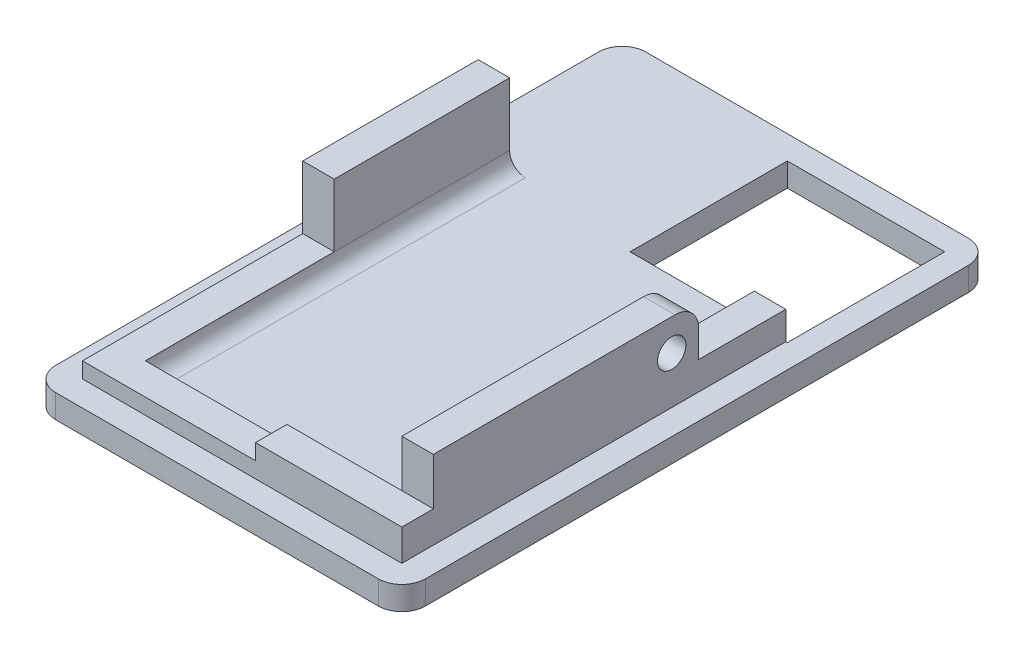
ISO-10303-21;
HEADER;
FILE_DESCRIPTION(('STEP AP214'),'2;1');
FILE_NAME('part.step','',(''),(''),'','','');
FILE_SCHEMA(('AUTOMOTIVE_DESIGN { 1 0 10303 214 1 1 1 1 }'));
ENDSEC;
DATA;
#1=APPLICATION_CONTEXT('core data for automotive mechanical design processes');
#2=APPLICATION_PROTOCOL_DEFINITION('international standard','automotive_design',2000,#1);
#3=PRODUCT_CONTEXT('',#1,'mechanical');
#4=PRODUCT('Part','Part','',(#3));
#5=PRODUCT_RELATED_PRODUCT_CATEGORY('part','',(#4));
#6=PRODUCT_DEFINITION_FORMATION('','',#4);
#7=PRODUCT_DEFINITION_CONTEXT('part definition',#1,'design');
#8=PRODUCT_DEFINITION('design','',#6,#7);
#9=PRODUCT_DEFINITION_SHAPE('','',#8);
#10=(LENGTH_UNIT() NAMED_UNIT(*) SI_UNIT(.MILLI.,.METRE.));
#11=(NAMED_UNIT(*) PLANE_ANGLE_UNIT() SI_UNIT($,.RADIAN.));
#12=(NAMED_UNIT(*) SI_UNIT($,.STERADIAN.) SOLID_ANGLE_UNIT());
#13=UNCERTAINTY_MEASURE_WITH_UNIT(LENGTH_MEASURE(1.E-05),#10,'distance_accuracy_value','');
#14=(GEOMETRIC_REPRESENTATION_CONTEXT(3) GLOBAL_UNCERTAINTY_ASSIGNED_CONTEXT((#13)) GLOBAL_UNIT_ASSIGNED_CONTEXT((#10,
#11,#12)) REPRESENTATION_CONTEXT('',''));
#15=CARTESIAN_POINT('',(0.,0.,0.));
#16=DIRECTION('',(0.,0.,1.));
#17=DIRECTION('',(1.,0.,0.));
#18=AXIS2_PLACEMENT_3D('',#15,#16,#17);
#19=CARTESIAN_POINT('',(0.,6.5,0.));
#20=DIRECTION('',(0.,1.,0.));
#21=DIRECTION('',(0.,0.,1.));
#22=AXIS2_PLACEMENT_3D('',#19,#20,#21);
#23=PLANE('',#22);
#24=DIRECTION('',(0.,0.,1.));
#25=VECTOR('',#24,1.);
#26=CARTESIAN_POINT('',(-10.15,6.5,-8.));
#27=LINE('',#26,#25);
#28=CARTESIAN_POINT('',(-10.15,6.5,-8.));
#29=VERTEX_POINT('',#28);
#30=CARTESIAN_POINT('',(-10.15,6.5,3.15));
#31=VERTEX_POINT('',#30);
#32=EDGE_CURVE('E382',#29,#31,#27,.T.);
#33=ORIENTED_EDGE('',*,*,#32,.T.);
#34=DIRECTION('',(-1.,0.,0.));
#35=VECTOR('',#34,1.);
#36=CARTESIAN_POINT('',(-10.15,6.5,3.15));
#37=LINE('',#36,#35);
#38=CARTESIAN_POINT('',(-8.15,6.5,3.15));
#39=VERTEX_POINT('',#38);
#40=EDGE_CURVE('E352',#39,#31,#37,.T.);
#41=ORIENTED_EDGE('',*,*,#40,.F.);
#42=DIRECTION('',(0.,0.,-1.));
#43=VECTOR('',#42,1.);
#44=CARTESIAN_POINT('',(-8.15,6.5,-8.));
#45=LINE('',#44,#43);
#46=CARTESIAN_POINT('',(-8.15,6.5,-8.));
#47=VERTEX_POINT('',#46);
#48=EDGE_CURVE('E393',#39,#47,#45,.T.);
#49=ORIENTED_EDGE('',*,*,#48,.T.);
#50=DIRECTION('',(-1.,0.,0.));
#51=VECTOR('',#50,1.);
#52=CARTESIAN_POINT('',(-10.15,6.5,-8.));
#53=LINE('',#52,#51);
#54=EDGE_CURVE('E396',#47,#29,#53,.T.);
#55=ORIENTED_EDGE('',*,*,#54,.T.);
#56=EDGE_LOOP('',(#33,#41,#49,#55));
#57=FACE_BOUND('',#56,.T.);
#58=ADVANCED_FACE('F38',(#57),#23,.T.);
#59=CARTESIAN_POINT('',(0.,1.5,0.));
#60=DIRECTION('',(0.,1.,0.));
#61=DIRECTION('',(0.,0.,1.));
#62=AXIS2_PLACEMENT_3D('',#59,#60,#61);
#63=PLANE('',#62);
#64=DIRECTION('',(1.,0.,0.));
#65=VECTOR('',#64,1.);
#66=CARTESIAN_POINT('',(0.,1.5,-7.24999999999999));
#67=LINE('',#66,#65);
#68=CARTESIAN_POINT('',(0.250000000000004,1.5,-7.24999999999999));
#69=VERTEX_POINT('',#68);
#70=CARTESIAN_POINT('',(7.15,1.5,-7.24999999999999));
#71=VERTEX_POINT('',#70);
#72=EDGE_CURVE('E297',#69,#71,#67,.T.);
#73=ORIENTED_EDGE('',*,*,#72,.F.);
#74=DIRECTION('',(0.,0.,1.));
#75=VECTOR('',#74,1.);
#76=CARTESIAN_POINT('',(0.250000000000003,1.5,0.));
#77=LINE('',#76,#75);
#78=CARTESIAN_POINT('',(0.250000000000005,1.5,-17.25));
#79=VERTEX_POINT('',#78);
#80=EDGE_CURVE('E309',#79,#69,#77,.T.);
#81=ORIENTED_EDGE('',*,*,#80,.F.);
#82=DIRECTION('',(-1.,0.,0.));
#83=VECTOR('',#82,1.);
#84=CARTESIAN_POINT('',(0.,1.5,-17.25));
#85=LINE('',#84,#83);
#86=CARTESIAN_POINT('',(10.25,1.5,-17.25));
#87=VERTEX_POINT('',#86);
#88=EDGE_CURVE('E303',#87,#79,#85,.T.);
#89=ORIENTED_EDGE('',*,*,#88,.F.);
#90=DIRECTION('',(0.,0.,-1.));
#91=VECTOR('',#90,1.);
#92=CARTESIAN_POINT('',(10.25,1.5,0.));
#93=LINE('',#92,#91);
#94=CARTESIAN_POINT('',(10.25,1.5,-7.24999999999999));
#95=VERTEX_POINT('',#94);
#96=EDGE_CURVE('E306',#95,#87,#93,.T.);
#97=ORIENTED_EDGE('',*,*,#96,.F.);
#98=CARTESIAN_POINT('',(10.15,1.5,-7.24999999999999));
#99=VERTEX_POINT('',#98);
#100=EDGE_CURVE('E300',#99,#95,#67,.T.);
#101=ORIENTED_EDGE('',*,*,#100,.F.);
#102=DIRECTION('',(0.,0.,-1.));
#103=VECTOR('',#102,1.);
#104=CARTESIAN_POINT('',(10.15,1.5,17.15));
#105=LINE('',#104,#103);
#106=CARTESIAN_POINT('',(10.15,1.5,17.15));
#107=VERTEX_POINT('',#106);
#108=EDGE_CURVE('E407',#107,#99,#105,.T.);
#109=ORIENTED_EDGE('',*,*,#108,.F.);
#110=DIRECTION('',(1.,0.,0.));
#111=VECTOR('',#110,1.);
#112=CARTESIAN_POINT('',(-8.79212820565967,1.5,17.15));
#113=LINE('',#112,#111);
#114=CARTESIAN_POINT('',(-10.15,1.5,17.15));
#115=VERTEX_POINT('',#114);
#116=EDGE_CURVE('E403',#115,#107,#113,.T.);
#117=ORIENTED_EDGE('',*,*,#116,.F.);
#118=DIRECTION('',(0.,0.,1.));
#119=VECTOR('',#118,1.);
#120=CARTESIAN_POINT('',(-10.15,1.5,-8.));
#121=LINE('',#120,#119);
#122=CARTESIAN_POINT('',(-10.15,1.5,-8.));
#123=VERTEX_POINT('',#122);
#124=EDGE_CURVE('E379',#123,#115,#121,.T.);
#125=ORIENTED_EDGE('',*,*,#124,.F.);
#126=DIRECTION('',(-1.,0.,0.));
#127=VECTOR('',#126,1.);
#128=CARTESIAN_POINT('',(-10.15,1.5,-8.));
#129=LINE('',#128,#127);
#130=CARTESIAN_POINT('',(-7.15,1.5,-8.));
#131=VERTEX_POINT('',#130);
#132=EDGE_CURVE('E387',#131,#123,#129,.T.);
#133=ORIENTED_EDGE('',*,*,#132,.F.);
#134=DIRECTION('',(0.,0.,-1.));
#135=VECTOR('',#134,1.);
#136=CARTESIAN_POINT('',(-7.15,1.5,0.));
#137=LINE('',#136,#135);
#138=CARTESIAN_POINT('',(-7.15,1.5,14.15));
#139=VERTEX_POINT('',#138);
#140=EDGE_CURVE('E524',#131,#139,#137,.F.);
#141=ORIENTED_EDGE('',*,*,#140,.T.);
#142=DIRECTION('',(-1.,0.,0.));
#143=VECTOR('',#142,1.);
#144=CARTESIAN_POINT('',(0.,1.5,14.15));
#145=LINE('',#144,#143);
#146=CARTESIAN_POINT('',(7.15000000000001,1.5,14.15));
#147=VERTEX_POINT('',#146);
#148=EDGE_CURVE('E521',#139,#147,#145,.F.);
#149=ORIENTED_EDGE('',*,*,#148,.T.);
#150=DIRECTION('',(0.,0.,1.));
#151=VECTOR('',#150,1.);
#152=CARTESIAN_POINT('',(7.15,1.5,0.));
#153=LINE('',#152,#151);
#154=EDGE_CURVE('E517',#147,#71,#153,.F.);
#155=ORIENTED_EDGE('',*,*,#154,.T.);
#156=EDGE_LOOP('',(#73,#81,#89,#97,#101,#109,#117,#125,#133,#141,#149,#155));
#157=FACE_BOUND('',#156,.T.);
#158=DIRECTION('',(-1.,0.,0.));
#159=VECTOR('',#158,1.);
#160=CARTESIAN_POINT('',(-11.75,1.5,-18.75));
#161=LINE('',#160,#159);
#162=CARTESIAN_POINT('',(10.25,1.5,-18.75));
#163=VERTEX_POINT('',#162);
#164=CARTESIAN_POINT('',(-10.25,1.5,-18.75));
#165=VERTEX_POINT('',#164);
#166=EDGE_CURVE('E443',#163,#165,#161,.T.);
#167=ORIENTED_EDGE('',*,*,#166,.T.);
#168=CARTESIAN_POINT('',(-10.25,1.5,-17.25));
#169=DIRECTION('',(0.,1.,0.));
#170=DIRECTION('',(0.,0.,1.));
#171=AXIS2_PLACEMENT_3D('',#168,#169,#170);
#172=CIRCLE('',#171,1.5);
#173=CARTESIAN_POINT('',(-11.75,1.5,-17.25));
#174=VERTEX_POINT('',#173);
#175=EDGE_CURVE('E496',#165,#174,#172,.T.);
#176=ORIENTED_EDGE('',*,*,#175,.T.);
#177=DIRECTION('',(0.,0.,1.));
#178=VECTOR('',#177,1.);
#179=CARTESIAN_POINT('',(-11.75,1.5,-18.75));
#180=LINE('',#179,#178);
#181=CARTESIAN_POINT('',(-11.75,1.5,17.25));
#182=VERTEX_POINT('',#181);
#183=EDGE_CURVE('E430',#174,#182,#180,.T.);
#184=ORIENTED_EDGE('',*,*,#183,.T.);
#185=CARTESIAN_POINT('',(-10.25,1.5,17.25));
#186=DIRECTION('',(0.,1.,0.));
#187=DIRECTION('',(0.,0.,1.));
#188=AXIS2_PLACEMENT_3D('',#185,#186,#187);
#189=CIRCLE('',#188,1.5);
#190=CARTESIAN_POINT('',(-10.25,1.5,18.75));
#191=VERTEX_POINT('',#190);
#192=EDGE_CURVE('E487',#182,#191,#189,.T.);
#193=ORIENTED_EDGE('',*,*,#192,.T.);
#194=DIRECTION('',(1.,0.,0.));
#195=VECTOR('',#194,1.);
#196=CARTESIAN_POINT('',(-11.75,1.5,18.75));
#197=LINE('',#196,#195);
#198=CARTESIAN_POINT('',(10.25,1.5,18.75));
#199=VERTEX_POINT('',#198);
#200=EDGE_CURVE('E434',#191,#199,#197,.T.);
#201=ORIENTED_EDGE('',*,*,#200,.T.);
#202=CARTESIAN_POINT('',(10.25,1.5,17.25));
#203=DIRECTION('',(0.,1.,0.));
#204=DIRECTION('',(0.,0.,1.));
#205=AXIS2_PLACEMENT_3D('',#202,#203,#204);
#206=CIRCLE('',#205,1.5);
#207=CARTESIAN_POINT('',(11.75,1.5,17.25));
#208=VERTEX_POINT('',#207);
#209=EDGE_CURVE('E490',#199,#208,#206,.T.);
#210=ORIENTED_EDGE('',*,*,#209,.T.);
#211=DIRECTION('',(0.,0.,-1.));
#212=VECTOR('',#211,1.);
#213=CARTESIAN_POINT('',(11.75,1.5,-18.75));
#214=LINE('',#213,#212);
#215=CARTESIAN_POINT('',(11.75,1.5,-17.25));
#216=VERTEX_POINT('',#215);
#217=EDGE_CURVE('E439',#208,#216,#214,.T.);
#218=ORIENTED_EDGE('',*,*,#217,.T.);
#219=CARTESIAN_POINT('',(10.25,1.5,-17.25));
#220=DIRECTION('',(0.,1.,0.));
#221=DIRECTION('',(0.,0.,1.));
#222=AXIS2_PLACEMENT_3D('',#219,#220,#221);
#223=CIRCLE('',#222,1.5);
#224=EDGE_CURVE('E493',#216,#163,#223,.T.);
#225=ORIENTED_EDGE('',*,*,#224,.T.);
#226=EDGE_LOOP('',(#167,#176,#184,#193,#201,#210,#218,#225));
#227=FACE_BOUND('',#226,.T.);
#228=ADVANCED_FACE('F578',(#157,#227),#63,.T.);
#229=CARTESIAN_POINT('',(-11.75,1.5,-18.75));
#230=DIRECTION('',(1.,0.,0.));
#231=DIRECTION('',(0.,0.,-1.));
#232=AXIS2_PLACEMENT_3D('',#229,#230,#231);
#233=PLANE('',#232);
#234=ORIENTED_EDGE('',*,*,#183,.F.);
#235=DIRECTION('',(0.,-1.,0.));
#236=VECTOR('',#235,1.);
#237=CARTESIAN_POINT('',(-11.75,1.5,-17.25));
#238=LINE('',#237,#236);
#239=CARTESIAN_POINT('',(-11.75,0.,-17.25));
#240=VERTEX_POINT('',#239);
#241=EDGE_CURVE('E464',#174,#240,#238,.T.);
#242=ORIENTED_EDGE('',*,*,#241,.T.);
#243=DIRECTION('',(0.,0.,1.));
#244=VECTOR('',#243,1.);
#245=CARTESIAN_POINT('',(-11.75,0.,-18.75));
#246=LINE('',#245,#244);
#247=CARTESIAN_POINT('',(-11.75,0.,17.25));
#248=VERTEX_POINT('',#247);
#249=EDGE_CURVE('E429',#240,#248,#246,.T.);
#250=ORIENTED_EDGE('',*,*,#249,.T.);
#251=DIRECTION('',(0.,-1.,0.));
#252=VECTOR('',#251,1.);
#253=CARTESIAN_POINT('',(-11.75,1.5,17.25));
#254=LINE('',#253,#252);
#255=EDGE_CURVE('E447',#248,#182,#254,.F.);
#256=ORIENTED_EDGE('',*,*,#255,.T.);
#257=EDGE_LOOP('',(#234,#242,#250,#256));
#258=FACE_BOUND('',#257,.T.);
#259=ADVANCED_FACE('F652',(#258),#233,.F.);
#260=CARTESIAN_POINT('',(-11.75,1.5,18.75));
#261=DIRECTION('',(0.,0.,-1.));
#262=DIRECTION('',(-1.,0.,0.));
#263=AXIS2_PLACEMENT_3D('',#260,#261,#262);
#264=PLANE('',#263);
#265=DIRECTION('',(1.,0.,0.));
#266=VECTOR('',#265,1.);
#267=CARTESIAN_POINT('',(-11.75,0.,18.75));
#268=LINE('',#267,#266);
#269=CARTESIAN_POINT('',(-10.25,0.,18.75));
#270=VERTEX_POINT('',#269);
#271=CARTESIAN_POINT('',(10.25,0.,18.75));
#272=VERTEX_POINT('',#271);
#273=EDGE_CURVE('E451',#270,#272,#268,.T.);
#274=ORIENTED_EDGE('',*,*,#273,.T.);
#275=DIRECTION('',(0.,-1.,0.));
#276=VECTOR('',#275,1.);
#277=CARTESIAN_POINT('',(10.25,1.5,18.75));
#278=LINE('',#277,#276);
#279=EDGE_CURVE('E510',#272,#199,#278,.F.);
#280=ORIENTED_EDGE('',*,*,#279,.T.);
#281=ORIENTED_EDGE('',*,*,#200,.F.);
#282=DIRECTION('',(0.,-1.,0.));
#283=VECTOR('',#282,1.);
#284=CARTESIAN_POINT('',(-10.25,1.5,18.75));
#285=LINE('',#284,#283);
#286=EDGE_CURVE('E506',#191,#270,#285,.T.);
#287=ORIENTED_EDGE('',*,*,#286,.T.);
#288=EDGE_LOOP('',(#274,#280,#281,#287));
#289=FACE_BOUND('',#288,.T.);
#290=ADVANCED_FACE('F694',(#289),#264,.F.);
#291=CARTESIAN_POINT('',(11.75,1.5,-18.75));
#292=DIRECTION('',(-1.,0.,0.));
#293=DIRECTION('',(0.,0.,1.));
#294=AXIS2_PLACEMENT_3D('',#291,#292,#293);
#295=PLANE('',#294);
#296=DIRECTION('',(0.,0.,-1.));
#297=VECTOR('',#296,1.);
#298=CARTESIAN_POINT('',(11.75,0.,-18.75));
#299=LINE('',#298,#297);
#300=CARTESIAN_POINT('',(11.75,0.,17.25));
#301=VERTEX_POINT('',#300);
#302=CARTESIAN_POINT('',(11.75,0.,-17.25));
#303=VERTEX_POINT('',#302);
#304=EDGE_CURVE('E455',#301,#303,#299,.T.);
#305=ORIENTED_EDGE('',*,*,#304,.T.);
#306=DIRECTION('',(0.,-1.,0.));
#307=VECTOR('',#306,1.);
#308=CARTESIAN_POINT('',(11.75,1.5,-17.25));
#309=LINE('',#308,#307);
#310=EDGE_CURVE('E503',#303,#216,#309,.F.);
#311=ORIENTED_EDGE('',*,*,#310,.T.);
#312=ORIENTED_EDGE('',*,*,#217,.F.);
#313=DIRECTION('',(0.,-1.,0.));
#314=VECTOR('',#313,1.);
#315=CARTESIAN_POINT('',(11.75,1.5,17.25));
#316=LINE('',#315,#314);
#317=EDGE_CURVE('E499',#208,#301,#316,.T.);
#318=ORIENTED_EDGE('',*,*,#317,.T.);
#319=EDGE_LOOP('',(#305,#311,#312,#318));
#320=FACE_BOUND('',#319,.T.);
#321=ADVANCED_FACE('F690',(#320),#295,.F.);
#322=CARTESIAN_POINT('',(-11.75,1.5,-18.75));
#323=DIRECTION('',(0.,0.,1.));
#324=DIRECTION('',(1.,0.,0.));
#325=AXIS2_PLACEMENT_3D('',#322,#323,#324);
#326=PLANE('',#325);
#327=DIRECTION('',(-1.,0.,0.));
#328=VECTOR('',#327,1.);
#329=CARTESIAN_POINT('',(-11.75,0.,-18.75));
#330=LINE('',#329,#328);
#331=CARTESIAN_POINT('',(10.25,0.,-18.75));
#332=VERTEX_POINT('',#331);
#333=CARTESIAN_POINT('',(-10.25,0.,-18.75));
#334=VERTEX_POINT('',#333);
#335=EDGE_CURVE('E435',#332,#334,#330,.T.);
#336=ORIENTED_EDGE('',*,*,#335,.T.);
#337=DIRECTION('',(0.,-1.,0.));
#338=VECTOR('',#337,1.);
#339=CARTESIAN_POINT('',(-10.25,1.5,-18.75));
#340=LINE('',#339,#338);
#341=EDGE_CURVE('E484',#334,#165,#340,.F.);
#342=ORIENTED_EDGE('',*,*,#341,.T.);
#343=ORIENTED_EDGE('',*,*,#166,.F.);
#344=DIRECTION('',(0.,-1.,0.));
#345=VECTOR('',#344,1.);
#346=CARTESIAN_POINT('',(10.25,1.5,-18.75));
#347=LINE('',#346,#345);
#348=EDGE_CURVE('E480',#163,#332,#347,.T.);
#349=ORIENTED_EDGE('',*,*,#348,.T.);
#350=EDGE_LOOP('',(#336,#342,#343,#349));
#351=FACE_BOUND('',#350,.T.);
#352=ADVANCED_FACE('F687',(#351),#326,.F.);
#353=CARTESIAN_POINT('',(0.,0.,0.));
#354=DIRECTION('',(0.,1.,0.));
#355=DIRECTION('',(0.,0.,1.));
#356=AXIS2_PLACEMENT_3D('',#353,#354,#355);
#357=PLANE('',#356);
#358=DIRECTION('',(1.,0.,0.));
#359=VECTOR('',#358,1.);
#360=CARTESIAN_POINT('',(0.250000000000005,0.,-17.25));
#361=LINE('',#360,#359);
#362=CARTESIAN_POINT('',(0.250000000000005,0.,-17.25));
#363=VERTEX_POINT('',#362);
#364=CARTESIAN_POINT('',(10.25,0.,-17.25));
#365=VERTEX_POINT('',#364);
#366=EDGE_CURVE('E269',#363,#365,#361,.T.);
#367=ORIENTED_EDGE('',*,*,#366,.F.);
#368=DIRECTION('',(0.,0.,-1.));
#369=VECTOR('',#368,1.);
#370=CARTESIAN_POINT('',(0.250000000000004,0.,-7.24999999999999));
#371=LINE('',#370,#369);
#372=CARTESIAN_POINT('',(0.250000000000004,0.,-7.24999999999999));
#373=VERTEX_POINT('',#372);
#374=EDGE_CURVE('E266',#373,#363,#371,.T.);
#375=ORIENTED_EDGE('',*,*,#374,.F.);
#376=DIRECTION('',(-1.,0.,0.));
#377=VECTOR('',#376,1.);
#378=CARTESIAN_POINT('',(0.250000000000004,0.,-7.24999999999999));
#379=LINE('',#378,#377);
#380=CARTESIAN_POINT('',(10.25,0.,-7.24999999999999));
#381=VERTEX_POINT('',#380);
#382=EDGE_CURVE('E277',#381,#373,#379,.T.);
#383=ORIENTED_EDGE('',*,*,#382,.F.);
#384=DIRECTION('',(0.,0.,1.));
#385=VECTOR('',#384,1.);
#386=CARTESIAN_POINT('',(10.25,0.,-7.24999999999999));
#387=LINE('',#386,#385);
#388=EDGE_CURVE('E273',#365,#381,#387,.T.);
#389=ORIENTED_EDGE('',*,*,#388,.F.);
#390=EDGE_LOOP('',(#367,#375,#383,#389));
#391=FACE_BOUND('',#390,.T.);
#392=ORIENTED_EDGE('',*,*,#249,.F.);
#393=CARTESIAN_POINT('',(-10.25,0.,-17.25));
#394=DIRECTION('',(0.,1.,0.));
#395=DIRECTION('',(0.,0.,1.));
#396=AXIS2_PLACEMENT_3D('',#393,#394,#395);
#397=CIRCLE('',#396,1.5);
#398=EDGE_CURVE('E477',#240,#334,#397,.F.);
#399=ORIENTED_EDGE('',*,*,#398,.T.);
#400=ORIENTED_EDGE('',*,*,#335,.F.);
#401=CARTESIAN_POINT('',(10.25,0.,-17.25));
#402=DIRECTION('',(0.,1.,0.));
#403=DIRECTION('',(0.,0.,1.));
#404=AXIS2_PLACEMENT_3D('',#401,#402,#403);
#405=CIRCLE('',#404,1.5);
#406=EDGE_CURVE('E474',#332,#303,#405,.F.);
#407=ORIENTED_EDGE('',*,*,#406,.T.);
#408=ORIENTED_EDGE('',*,*,#304,.F.);
#409=CARTESIAN_POINT('',(10.25,0.,17.25));
#410=DIRECTION('',(0.,1.,0.));
#411=DIRECTION('',(0.,0.,1.));
#412=AXIS2_PLACEMENT_3D('',#409,#410,#411);
#413=CIRCLE('',#412,1.5);
#414=EDGE_CURVE('E471',#301,#272,#413,.F.);
#415=ORIENTED_EDGE('',*,*,#414,.T.);
#416=ORIENTED_EDGE('',*,*,#273,.F.);
#417=CARTESIAN_POINT('',(-10.25,0.,17.25));
#418=DIRECTION('',(0.,1.,0.));
#419=DIRECTION('',(0.,0.,1.));
#420=AXIS2_PLACEMENT_3D('',#417,#418,#419);
#421=CIRCLE('',#420,1.5);
#422=EDGE_CURVE('E468',#270,#248,#421,.F.);
#423=ORIENTED_EDGE('',*,*,#422,.T.);
#424=EDGE_LOOP('',(#392,#399,#400,#407,#408,#415,#416,#423));
#425=FACE_BOUND('',#424,.T.);
#426=ADVANCED_FACE('F590',(#391,#425),#357,.F.);
#427=CARTESIAN_POINT('',(-10.25,1.5,-17.25));
#428=DIRECTION('',(0.,-1.,0.));
#429=DIRECTION('',(0.,0.,-1.));
#430=AXIS2_PLACEMENT_3D('',#427,#428,#429);
#431=CYLINDRICAL_SURFACE('',#430,1.5);
#432=ORIENTED_EDGE('',*,*,#175,.F.);
#433=ORIENTED_EDGE('',*,*,#341,.F.);
#434=ORIENTED_EDGE('',*,*,#398,.F.);
#435=ORIENTED_EDGE('',*,*,#241,.F.);
#436=EDGE_LOOP('',(#432,#433,#434,#435));
#437=FACE_BOUND('',#436,.T.);
#438=ADVANCED_FACE('F686',(#437),#431,.T.);
#439=CARTESIAN_POINT('',(10.25,1.5,-17.25));
#440=DIRECTION('',(0.,-1.,0.));
#441=DIRECTION('',(0.,0.,-1.));
#442=AXIS2_PLACEMENT_3D('',#439,#440,#441);
#443=CYLINDRICAL_SURFACE('',#442,1.5);
#444=ORIENTED_EDGE('',*,*,#224,.F.);
#445=ORIENTED_EDGE('',*,*,#310,.F.);
#446=ORIENTED_EDGE('',*,*,#406,.F.);
#447=ORIENTED_EDGE('',*,*,#348,.F.);
#448=EDGE_LOOP('',(#444,#445,#446,#447));
#449=FACE_BOUND('',#448,.T.);
#450=ADVANCED_FACE('F704',(#449),#443,.T.);
#451=CARTESIAN_POINT('',(10.25,1.5,17.25));
#452=DIRECTION('',(0.,-1.,0.));
#453=DIRECTION('',(0.,0.,-1.));
#454=AXIS2_PLACEMENT_3D('',#451,#452,#453);
#455=CYLINDRICAL_SURFACE('',#454,1.5);
#456=ORIENTED_EDGE('',*,*,#209,.F.);
#457=ORIENTED_EDGE('',*,*,#279,.F.);
#458=ORIENTED_EDGE('',*,*,#414,.F.);
#459=ORIENTED_EDGE('',*,*,#317,.F.);
#460=EDGE_LOOP('',(#456,#457,#458,#459));
#461=FACE_BOUND('',#460,.T.);
#462=ADVANCED_FACE('F708',(#461),#455,.T.);
#463=CARTESIAN_POINT('',(-10.25,1.5,17.25));
#464=DIRECTION('',(0.,-1.,0.));
#465=DIRECTION('',(0.,0.,-1.));
#466=AXIS2_PLACEMENT_3D('',#463,#464,#465);
#467=CYLINDRICAL_SURFACE('',#466,1.5);
#468=ORIENTED_EDGE('',*,*,#192,.F.);
#469=ORIENTED_EDGE('',*,*,#255,.F.);
#470=ORIENTED_EDGE('',*,*,#422,.F.);
#471=ORIENTED_EDGE('',*,*,#286,.F.);
#472=EDGE_LOOP('',(#468,#469,#470,#471));
#473=FACE_BOUND('',#472,.T.);
#474=ADVANCED_FACE('F682',(#473),#467,.T.);
#475=CARTESIAN_POINT('',(-10.15,6.5,-8.));
#476=DIRECTION('',(1.,0.,0.));
#477=DIRECTION('',(0.,0.,-1.));
#478=AXIS2_PLACEMENT_3D('',#475,#476,#477);
#479=PLANE('',#478);
#480=DIRECTION('',(0.,0.,1.));
#481=VECTOR('',#480,1.);
#482=CARTESIAN_POINT('',(-10.15,2.5,17.15));
#483=LINE('',#482,#481);
#484=CARTESIAN_POINT('',(-10.15,2.5,3.15));
#485=VERTEX_POINT('',#484);
#486=CARTESIAN_POINT('',(-10.15,2.5,17.15));
#487=VERTEX_POINT('',#486);
#488=EDGE_CURVE('E359',#485,#487,#483,.T.);
#489=ORIENTED_EDGE('',*,*,#488,.F.);
#490=DIRECTION('',(0.,-1.,0.));
#491=VECTOR('',#490,1.);
#492=CARTESIAN_POINT('',(-10.15,6.5,3.15));
#493=LINE('',#492,#491);
#494=EDGE_CURVE('E341',#31,#485,#493,.T.);
#495=ORIENTED_EDGE('',*,*,#494,.F.);
#496=ORIENTED_EDGE('',*,*,#32,.F.);
#497=DIRECTION('',(0.,-1.,0.));
#498=VECTOR('',#497,1.);
#499=CARTESIAN_POINT('',(-10.15,6.5,-8.));
#500=LINE('',#499,#498);
#501=EDGE_CURVE('E399',#29,#123,#500,.T.);
#502=ORIENTED_EDGE('',*,*,#501,.T.);
#503=ORIENTED_EDGE('',*,*,#124,.T.);
#504=DIRECTION('',(0.,-1.,0.));
#505=VECTOR('',#504,1.);
#506=CARTESIAN_POINT('',(-10.15,6.5,17.15));
#507=LINE('',#506,#505);
#508=EDGE_CURVE('E426',#487,#115,#507,.T.);
#509=ORIENTED_EDGE('',*,*,#508,.F.);
#510=EDGE_LOOP('',(#489,#495,#496,#502,#503,#509));
#511=FACE_BOUND('',#510,.T.);
#512=ADVANCED_FACE('F621',(#511),#479,.F.);
#513=CARTESIAN_POINT('',(-8.79212820565967,6.5,17.15));
#514=DIRECTION('',(0.,0.,-1.));
#515=DIRECTION('',(-1.,0.,0.));
#516=AXIS2_PLACEMENT_3D('',#513,#514,#515);
#517=PLANE('',#516);
#518=DIRECTION('',(0.,-1.,0.));
#519=VECTOR('',#518,1.);
#520=CARTESIAN_POINT('',(10.15,6.5,17.15));
#521=LINE('',#520,#519);
#522=CARTESIAN_POINT('',(10.15,3.5,17.15));
#523=VERTEX_POINT('',#522);
#524=EDGE_CURVE('E423',#523,#107,#521,.T.);
#525=ORIENTED_EDGE('',*,*,#524,.F.);
#526=DIRECTION('',(-1.,0.,0.));
#527=VECTOR('',#526,1.);
#528=CARTESIAN_POINT('',(12.85,3.5,17.15));
#529=LINE('',#528,#527);
#530=CARTESIAN_POINT('',(0.850000000000004,3.5,17.15));
#531=VERTEX_POINT('',#530);
#532=EDGE_CURVE('E327',#523,#531,#529,.T.);
#533=ORIENTED_EDGE('',*,*,#532,.T.);
#534=DIRECTION('',(0.,1.,0.));
#535=VECTOR('',#534,1.);
#536=CARTESIAN_POINT('',(0.850000000000004,6.5,17.15));
#537=LINE('',#536,#535);
#538=CARTESIAN_POINT('',(0.850000000000004,2.5,17.15));
#539=VERTEX_POINT('',#538);
#540=EDGE_CURVE('E360',#539,#531,#537,.T.);
#541=ORIENTED_EDGE('',*,*,#540,.F.);
#542=DIRECTION('',(-1.,0.,0.));
#543=VECTOR('',#542,1.);
#544=CARTESIAN_POINT('',(0.850000000000004,2.5,17.15));
#545=LINE('',#544,#543);
#546=EDGE_CURVE('E375',#539,#487,#545,.T.);
#547=ORIENTED_EDGE('',*,*,#546,.T.);
#548=ORIENTED_EDGE('',*,*,#508,.T.);
#549=ORIENTED_EDGE('',*,*,#116,.T.);
#550=EDGE_LOOP('',(#525,#533,#541,#547,#548,#549));
#551=FACE_BOUND('',#550,.T.);
#552=ADVANCED_FACE('F619',(#551),#517,.F.);
#553=CARTESIAN_POINT('',(10.15,6.5,17.15));
#554=DIRECTION('',(-1.,0.,0.));
#555=DIRECTION('',(0.,0.,1.));
#556=AXIS2_PLACEMENT_3D('',#553,#554,#555);
#557=PLANE('',#556);
#558=CARTESIAN_POINT('',(10.15,4.5,0.));
#559=DIRECTION('',(1.,0.,0.));
#560=DIRECTION('',(0.,0.,-1.));
#561=AXIS2_PLACEMENT_3D('',#558,#559,#560);
#562=CIRCLE('',#561,0.9);
#563=CARTESIAN_POINT('',(10.15,4.5,-0.9));
#564=VERTEX_POINT('',#563);
#565=EDGE_CURVE('E312',#564,#564,#562,.T.);
#566=ORIENTED_EDGE('',*,*,#565,.F.);
#567=EDGE_LOOP('',(#566));
#568=FACE_BOUND('',#567,.T.);
#569=DIRECTION('',(0.,-1.,0.));
#570=VECTOR('',#569,1.);
#571=CARTESIAN_POINT('',(10.15,6.5,-1.71653397257016));
#572=LINE('',#571,#570);
#573=CARTESIAN_POINT('',(10.15,5.,-1.71653397257016));
#574=VERTEX_POINT('',#573);
#575=CARTESIAN_POINT('',(10.15,3.28554658043928,-1.71653397257016));
#576=VERTEX_POINT('',#575);
#577=EDGE_CURVE('E235',#574,#576,#572,.T.);
#578=ORIENTED_EDGE('',*,*,#577,.F.);
#579=CARTESIAN_POINT('',(10.15,5.,-0.216533972570158));
#580=DIRECTION('',(-1.,0.,0.));
#581=DIRECTION('',(0.,0.,1.));
#582=AXIS2_PLACEMENT_3D('',#579,#580,#581);
#583=CIRCLE('',#582,1.5);
#584=CARTESIAN_POINT('',(10.15,6.5,-0.216533972570158));
#585=VERTEX_POINT('',#584);
#586=EDGE_CURVE('E61',#574,#585,#583,.F.);
#587=ORIENTED_EDGE('',*,*,#586,.T.);
#588=DIRECTION('',(0.,0.,-1.));
#589=VECTOR('',#588,1.);
#590=CARTESIAN_POINT('',(10.15,6.5,17.15));
#591=LINE('',#590,#589);
#592=CARTESIAN_POINT('',(10.15,6.5,15.15));
#593=VERTEX_POINT('',#592);
#594=EDGE_CURVE('E386',#593,#585,#591,.T.);
#595=ORIENTED_EDGE('',*,*,#594,.F.);
#596=DIRECTION('',(0.,-1.,0.));
#597=VECTOR('',#596,1.);
#598=CARTESIAN_POINT('',(10.15,6.5,15.15));
#599=LINE('',#598,#597);
#600=CARTESIAN_POINT('',(10.15,3.5,15.15));
#601=VERTEX_POINT('',#600);
#602=EDGE_CURVE('E337',#593,#601,#599,.T.);
#603=ORIENTED_EDGE('',*,*,#602,.T.);
#604=DIRECTION('',(0.,0.,1.));
#605=VECTOR('',#604,1.);
#606=CARTESIAN_POINT('',(10.15,3.5,17.15));
#607=LINE('',#606,#605);
#608=EDGE_CURVE('E326',#601,#523,#607,.T.);
#609=ORIENTED_EDGE('',*,*,#608,.T.);
#610=ORIENTED_EDGE('',*,*,#524,.T.);
#611=ORIENTED_EDGE('',*,*,#108,.T.);
#612=DIRECTION('',(0.,1.,0.));
#613=VECTOR('',#612,1.);
#614=CARTESIAN_POINT('',(10.15,6.5,-7.24999999999999));
#615=LINE('',#614,#613);
#616=CARTESIAN_POINT('',(10.15,3.28554658043928,-7.24999999999999));
#617=VERTEX_POINT('',#616);
#618=EDGE_CURVE('E257',#99,#617,#615,.T.);
#619=ORIENTED_EDGE('',*,*,#618,.T.);
#620=DIRECTION('',(0.,0.,-1.));
#621=VECTOR('',#620,1.);
#622=CARTESIAN_POINT('',(10.15,3.28554658043929,-7.24999999999999));
#623=LINE('',#622,#621);
#624=EDGE_CURVE('E244',#576,#617,#623,.T.);
#625=ORIENTED_EDGE('',*,*,#624,.F.);
#626=EDGE_LOOP('',(#578,#587,#595,#603,#609,#610,#611,#619,#625));
#627=FACE_BOUND('',#626,.T.);
#628=ADVANCED_FACE('F255',(#568,#627),#557,.F.);
#629=CARTESIAN_POINT('',(8.15,6.5,-8.00000000000001));
#630=DIRECTION('',(1.,0.,0.));
#631=DIRECTION('',(0.,0.,-1.));
#632=AXIS2_PLACEMENT_3D('',#629,#630,#631);
#633=PLANE('',#632);
#634=CARTESIAN_POINT('',(8.15,4.5,0.));
#635=DIRECTION('',(1.,0.,0.));
#636=DIRECTION('',(0.,0.,-1.));
#637=AXIS2_PLACEMENT_3D('',#634,#635,#636);
#638=CIRCLE('',#637,0.9);
#639=CARTESIAN_POINT('',(8.15,4.5,-0.9));
#640=VERTEX_POINT('',#639);
#641=EDGE_CURVE('E316',#640,#640,#638,.T.);
#642=ORIENTED_EDGE('',*,*,#641,.T.);
#643=EDGE_LOOP('',(#642));
#644=FACE_BOUND('',#643,.T.);
#645=DIRECTION('',(0.,0.,1.));
#646=VECTOR('',#645,1.);
#647=CARTESIAN_POINT('',(8.15,6.5,-8.00000000000001));
#648=LINE('',#647,#646);
#649=CARTESIAN_POINT('',(8.15,6.5,-0.216533972570159));
#650=VERTEX_POINT('',#649);
#651=CARTESIAN_POINT('',(8.15,6.5,15.15));
#652=VERTEX_POINT('',#651);
#653=EDGE_CURVE('E390',#650,#652,#648,.T.);
#654=ORIENTED_EDGE('',*,*,#653,.F.);
#655=CARTESIAN_POINT('',(8.15,5.,-0.216533972570158));
#656=DIRECTION('',(1.,0.,0.));
#657=DIRECTION('',(0.,0.,-1.));
#658=AXIS2_PLACEMENT_3D('',#655,#656,#657);
#659=CIRCLE('',#658,1.5);
#660=CARTESIAN_POINT('',(8.15,5.,-1.71653397257016));
#661=VERTEX_POINT('',#660);
#662=EDGE_CURVE('E11',#650,#661,#659,.F.);
#663=ORIENTED_EDGE('',*,*,#662,.T.);
#664=DIRECTION('',(0.,-1.,0.));
#665=VECTOR('',#664,1.);
#666=CARTESIAN_POINT('',(8.15,6.5,-1.71653397257016));
#667=LINE('',#666,#665);
#668=CARTESIAN_POINT('',(8.15,3.28554658043928,-1.71653397257016));
#669=VERTEX_POINT('',#668);
#670=EDGE_CURVE('E263',#661,#669,#667,.T.);
#671=ORIENTED_EDGE('',*,*,#670,.T.);
#672=DIRECTION('',(0.,0.,-1.));
#673=VECTOR('',#672,1.);
#674=CARTESIAN_POINT('',(8.15,3.28554658043929,-8.00000000000001));
#675=LINE('',#674,#673);
#676=CARTESIAN_POINT('',(8.15,3.28554658043929,-7.24999999999999));
#677=VERTEX_POINT('',#676);
#678=EDGE_CURVE('E251',#669,#677,#675,.T.);
#679=ORIENTED_EDGE('',*,*,#678,.T.);
#680=DIRECTION('',(0.,-1.,0.));
#681=VECTOR('',#680,1.);
#682=CARTESIAN_POINT('',(8.15,6.5,-7.24999999999999));
#683=LINE('',#682,#681);
#684=CARTESIAN_POINT('',(8.15,2.5,-7.24999999999999));
#685=VERTEX_POINT('',#684);
#686=EDGE_CURVE('E285',#677,#685,#683,.T.);
#687=ORIENTED_EDGE('',*,*,#686,.T.);
#688=DIRECTION('',(0.,0.,1.));
#689=VECTOR('',#688,1.);
#690=CARTESIAN_POINT('',(8.15,2.5,-8.00000000000001));
#691=LINE('',#690,#689);
#692=CARTESIAN_POINT('',(8.15000000000001,2.5,15.15));
#693=VERTEX_POINT('',#692);
#694=EDGE_CURVE('E530',#685,#693,#691,.T.);
#695=ORIENTED_EDGE('',*,*,#694,.T.);
#696=DIRECTION('',(0.,-1.,0.));
#697=VECTOR('',#696,1.);
#698=CARTESIAN_POINT('',(8.15000000000001,6.5,15.15));
#699=LINE('',#698,#697);
#700=CARTESIAN_POINT('',(8.15000000000001,3.5,15.15));
#701=VERTEX_POINT('',#700);
#702=EDGE_CURVE('E419',#701,#693,#699,.T.);
#703=ORIENTED_EDGE('',*,*,#702,.F.);
#704=EDGE_CURVE('E420',#652,#701,#699,.T.);
#705=ORIENTED_EDGE('',*,*,#704,.F.);
#706=EDGE_LOOP('',(#654,#663,#671,#679,#687,#695,#703,#705));
#707=FACE_BOUND('',#706,.T.);
#708=ADVANCED_FACE('F635',(#644,#707),#633,.F.);
#709=CARTESIAN_POINT('',(8.15000000000001,6.5,15.15));
#710=DIRECTION('',(0.,0.,1.));
#711=DIRECTION('',(1.,0.,0.));
#712=AXIS2_PLACEMENT_3D('',#709,#710,#711);
#713=PLANE('',#712);
#714=ORIENTED_EDGE('',*,*,#702,.T.);
#715=DIRECTION('',(-1.,0.,0.));
#716=VECTOR('',#715,1.);
#717=CARTESIAN_POINT('',(8.15000000000001,2.5,15.15));
#718=LINE('',#717,#716);
#719=CARTESIAN_POINT('',(0.850000000000004,2.5,15.15));
#720=VERTEX_POINT('',#719);
#721=EDGE_CURVE('E513',#693,#720,#718,.T.);
#722=ORIENTED_EDGE('',*,*,#721,.T.);
#723=DIRECTION('',(0.,-1.,0.));
#724=VECTOR('',#723,1.);
#725=CARTESIAN_POINT('',(0.850000000000004,6.5,15.15));
#726=LINE('',#725,#724);
#727=CARTESIAN_POINT('',(0.850000000000004,3.5,15.15));
#728=VERTEX_POINT('',#727);
#729=EDGE_CURVE('E364',#728,#720,#726,.T.);
#730=ORIENTED_EDGE('',*,*,#729,.F.);
#731=DIRECTION('',(-1.,0.,0.));
#732=VECTOR('',#731,1.);
#733=CARTESIAN_POINT('',(12.85,3.5,15.15));
#734=LINE('',#733,#732);
#735=EDGE_CURVE('E320',#701,#728,#734,.T.);
#736=ORIENTED_EDGE('',*,*,#735,.F.);
#737=EDGE_LOOP('',(#714,#722,#730,#736));
#738=FACE_BOUND('',#737,.T.);
#739=ADVANCED_FACE('F605',(#738),#713,.F.);
#740=CARTESIAN_POINT('',(-8.15,6.5,-8.));
#741=DIRECTION('',(-1.,0.,0.));
#742=DIRECTION('',(0.,0.,1.));
#743=AXIS2_PLACEMENT_3D('',#740,#741,#742);
#744=PLANE('',#743);
#745=DIRECTION('',(0.,1.,0.));
#746=VECTOR('',#745,1.);
#747=CARTESIAN_POINT('',(-8.15,6.5,3.15));
#748=LINE('',#747,#746);
#749=CARTESIAN_POINT('',(-8.15,2.5,3.15));
#750=VERTEX_POINT('',#749);
#751=EDGE_CURVE('E349',#750,#39,#748,.T.);
#752=ORIENTED_EDGE('',*,*,#751,.F.);
#753=DIRECTION('',(0.,0.,-1.));
#754=VECTOR('',#753,1.);
#755=CARTESIAN_POINT('',(-8.15,2.5,-8.));
#756=LINE('',#755,#754);
#757=CARTESIAN_POINT('',(-8.15,2.5,-8.));
#758=VERTEX_POINT('',#757);
#759=EDGE_CURVE('E527',#750,#758,#756,.T.);
#760=ORIENTED_EDGE('',*,*,#759,.T.);
#761=DIRECTION('',(0.,-1.,0.));
#762=VECTOR('',#761,1.);
#763=CARTESIAN_POINT('',(-8.15,6.5,-8.));
#764=LINE('',#763,#762);
#765=EDGE_CURVE('E415',#47,#758,#764,.T.);
#766=ORIENTED_EDGE('',*,*,#765,.F.);
#767=ORIENTED_EDGE('',*,*,#48,.F.);
#768=EDGE_LOOP('',(#752,#760,#766,#767));
#769=FACE_BOUND('',#768,.T.);
#770=ADVANCED_FACE('F664',(#769),#744,.F.);
#771=CARTESIAN_POINT('',(-10.15,6.5,-8.));
#772=DIRECTION('',(0.,0.,1.));
#773=DIRECTION('',(1.,0.,0.));
#774=AXIS2_PLACEMENT_3D('',#771,#772,#773);
#775=PLANE('',#774);
#776=ORIENTED_EDGE('',*,*,#132,.T.);
#777=ORIENTED_EDGE('',*,*,#501,.F.);
#778=ORIENTED_EDGE('',*,*,#54,.F.);
#779=ORIENTED_EDGE('',*,*,#765,.T.);
#780=CARTESIAN_POINT('',(-7.15,2.5,-8.));
#781=DIRECTION('',(0.,0.,1.));
#782=DIRECTION('',(1.,0.,0.));
#783=AXIS2_PLACEMENT_3D('',#780,#781,#782);
#784=CIRCLE('',#783,1.);
#785=EDGE_CURVE('E533',#758,#131,#784,.T.);
#786=ORIENTED_EDGE('',*,*,#785,.T.);
#787=EDGE_LOOP('',(#776,#777,#778,#779,#786));
#788=FACE_BOUND('',#787,.T.);
#789=ADVANCED_FACE('F657',(#788),#775,.F.);
#790=ORIENTED_EDGE('',*,*,#594,.T.);
#791=DIRECTION('',(1.,0.,0.));
#792=VECTOR('',#791,1.);
#793=CARTESIAN_POINT('',(8.15,6.5,-0.216533972570158));
#794=LINE('',#793,#792);
#795=EDGE_CURVE('E47',#585,#650,#794,.F.);
#796=ORIENTED_EDGE('',*,*,#795,.T.);
#797=ORIENTED_EDGE('',*,*,#653,.T.);
#798=DIRECTION('',(-1.,0.,0.));
#799=VECTOR('',#798,1.);
#800=CARTESIAN_POINT('',(12.85,6.5,15.15));
#801=LINE('',#800,#799);
#802=EDGE_CURVE('E322',#593,#652,#801,.T.);
#803=ORIENTED_EDGE('',*,*,#802,.F.);
#804=EDGE_LOOP('',(#790,#796,#797,#803));
#805=FACE_BOUND('',#804,.T.);
#806=ADVANCED_FACE('F646',(#805),#23,.T.);
#807=CARTESIAN_POINT('',(0.850000000000004,2.5,17.15));
#808=DIRECTION('',(0.,-1.,0.));
#809=DIRECTION('',(0.,0.,-1.));
#810=AXIS2_PLACEMENT_3D('',#807,#808,#809);
#811=PLANE('',#810);
#812=ORIENTED_EDGE('',*,*,#488,.T.);
#813=ORIENTED_EDGE('',*,*,#546,.F.);
#814=DIRECTION('',(0.,0.,1.));
#815=VECTOR('',#814,1.);
#816=CARTESIAN_POINT('',(0.850000000000004,2.5,17.15));
#817=LINE('',#816,#815);
#818=EDGE_CURVE('E368',#720,#539,#817,.T.);
#819=ORIENTED_EDGE('',*,*,#818,.F.);
#820=DIRECTION('',(-1.,0.,0.));
#821=VECTOR('',#820,1.);
#822=CARTESIAN_POINT('',(0.850000000000004,2.5,15.15));
#823=LINE('',#822,#821);
#824=CARTESIAN_POINT('',(-8.15,2.5,15.15));
#825=VERTEX_POINT('',#824);
#826=EDGE_CURVE('E372',#720,#825,#823,.T.);
#827=ORIENTED_EDGE('',*,*,#826,.T.);
#828=DIRECTION('',(0.,0.,1.));
#829=VECTOR('',#828,1.);
#830=CARTESIAN_POINT('',(-8.15,2.5,3.15));
#831=LINE('',#830,#829);
#832=EDGE_CURVE('E355',#750,#825,#831,.T.);
#833=ORIENTED_EDGE('',*,*,#832,.F.);
#834=DIRECTION('',(1.,0.,0.));
#835=VECTOR('',#834,1.);
#836=CARTESIAN_POINT('',(-10.15,2.5,3.15));
#837=LINE('',#836,#835);
#838=EDGE_CURVE('E345',#485,#750,#837,.T.);
#839=ORIENTED_EDGE('',*,*,#838,.F.);
#840=EDGE_LOOP('',(#812,#813,#819,#827,#833,#839));
#841=FACE_BOUND('',#840,.T.);
#842=ADVANCED_FACE('F614',(#841),#811,.F.);
#843=CARTESIAN_POINT('',(0.850000000000004,0.,0.));
#844=DIRECTION('',(1.,0.,0.));
#845=DIRECTION('',(0.,0.,-1.));
#846=AXIS2_PLACEMENT_3D('',#843,#844,#845);
#847=PLANE('',#846);
#848=ORIENTED_EDGE('',*,*,#540,.T.);
#849=DIRECTION('',(0.,0.,1.));
#850=VECTOR('',#849,1.);
#851=CARTESIAN_POINT('',(0.850000000000004,3.5,15.15));
#852=LINE('',#851,#850);
#853=EDGE_CURVE('E317',#728,#531,#852,.T.);
#854=ORIENTED_EDGE('',*,*,#853,.F.);
#855=ORIENTED_EDGE('',*,*,#729,.T.);
#856=ORIENTED_EDGE('',*,*,#818,.T.);
#857=EDGE_LOOP('',(#848,#854,#855,#856));
#858=FACE_BOUND('',#857,.T.);
#859=ADVANCED_FACE('F611',(#858),#847,.F.);
#860=CARTESIAN_POINT('',(0.,0.,3.15));
#861=DIRECTION('',(0.,0.,1.));
#862=DIRECTION('',(1.,0.,0.));
#863=AXIS2_PLACEMENT_3D('',#860,#861,#862);
#864=PLANE('',#863);
#865=ORIENTED_EDGE('',*,*,#494,.T.);
#866=ORIENTED_EDGE('',*,*,#838,.T.);
#867=ORIENTED_EDGE('',*,*,#751,.T.);
#868=ORIENTED_EDGE('',*,*,#40,.T.);
#869=EDGE_LOOP('',(#865,#866,#867,#868));
#870=FACE_BOUND('',#869,.T.);
#871=ADVANCED_FACE('F731',(#870),#864,.T.);
#872=CARTESIAN_POINT('',(12.85,6.5,15.15));
#873=DIRECTION('',(0.,0.,-1.));
#874=DIRECTION('',(-1.,0.,0.));
#875=AXIS2_PLACEMENT_3D('',#872,#873,#874);
#876=PLANE('',#875);
#877=ORIENTED_EDGE('',*,*,#802,.T.);
#878=ORIENTED_EDGE('',*,*,#704,.T.);
#879=EDGE_CURVE('E331',#601,#701,#734,.T.);
#880=ORIENTED_EDGE('',*,*,#879,.F.);
#881=ORIENTED_EDGE('',*,*,#602,.F.);
#882=EDGE_LOOP('',(#877,#878,#880,#881));
#883=FACE_BOUND('',#882,.T.);
#884=ADVANCED_FACE('F631',(#883),#876,.F.);
#885=CARTESIAN_POINT('',(12.85,3.5,15.15));
#886=DIRECTION('',(0.,-1.,0.));
#887=DIRECTION('',(0.,0.,-1.));
#888=AXIS2_PLACEMENT_3D('',#885,#886,#887);
#889=PLANE('',#888);
#890=ORIENTED_EDGE('',*,*,#879,.T.);
#891=ORIENTED_EDGE('',*,*,#735,.T.);
#892=ORIENTED_EDGE('',*,*,#853,.T.);
#893=ORIENTED_EDGE('',*,*,#532,.F.);
#894=ORIENTED_EDGE('',*,*,#608,.F.);
#895=EDGE_LOOP('',(#890,#891,#892,#893,#894));
#896=FACE_BOUND('',#895,.T.);
#897=ADVANCED_FACE('F629',(#896),#889,.F.);
#898=CARTESIAN_POINT('',(7.15,2.5,-8.00000000000001));
#899=DIRECTION('',(0.,0.,1.));
#900=DIRECTION('',(1.,0.,0.));
#901=AXIS2_PLACEMENT_3D('',#898,#899,#900);
#902=CYLINDRICAL_SURFACE('',#901,1.);
#903=ORIENTED_EDGE('',*,*,#694,.F.);
#904=CARTESIAN_POINT('',(7.15,2.5,-7.24999999999999));
#905=DIRECTION('',(0.,0.,1.));
#906=DIRECTION('',(1.,0.,0.));
#907=AXIS2_PLACEMENT_3D('',#904,#905,#906);
#908=CIRCLE('',#907,1.);
#909=EDGE_CURVE('E537',#685,#71,#908,.F.);
#910=ORIENTED_EDGE('',*,*,#909,.T.);
#911=ORIENTED_EDGE('',*,*,#154,.F.);
#912=CARTESIAN_POINT('',(7.15000000000001,2.5,14.15));
#913=DIRECTION('',(-0.707106781186547,0.,0.707106781186548));
#914=DIRECTION('',(-0.707106781186548,0.,-0.707106781186547));
#915=AXIS2_PLACEMENT_3D('',#912,#913,#914);
#916=ELLIPSE('',#915,1.4142135623731,1.);
#917=EDGE_CURVE('E321',#693,#147,#916,.F.);
#918=ORIENTED_EDGE('',*,*,#917,.F.);
#919=EDGE_LOOP('',(#903,#910,#911,#918));
#920=FACE_BOUND('',#919,.T.);
#921=ADVANCED_FACE('F598',(#920),#902,.F.);
#922=CARTESIAN_POINT('',(-7.15,2.5,-8.));
#923=DIRECTION('',(0.,0.,-1.));
#924=DIRECTION('',(-1.,0.,0.));
#925=AXIS2_PLACEMENT_3D('',#922,#923,#924);
#926=CYLINDRICAL_SURFACE('',#925,1.);
#927=ORIENTED_EDGE('',*,*,#759,.F.);
#928=ORIENTED_EDGE('',*,*,#832,.T.);
#929=CARTESIAN_POINT('',(-7.15,2.5,14.15));
#930=DIRECTION('',(-0.707106781186548,0.,-0.707106781186547));
#931=DIRECTION('',(-0.707106781186547,0.,0.707106781186548));
#932=AXIS2_PLACEMENT_3D('',#929,#930,#931);
#933=ELLIPSE('',#932,1.41421356237309,1.);
#934=EDGE_CURVE('E538',#139,#825,#933,.T.);
#935=ORIENTED_EDGE('',*,*,#934,.F.);
#936=ORIENTED_EDGE('',*,*,#140,.F.);
#937=ORIENTED_EDGE('',*,*,#785,.F.);
#938=EDGE_LOOP('',(#927,#928,#935,#936,#937));
#939=FACE_BOUND('',#938,.T.);
#940=ADVANCED_FACE('F719',(#939),#926,.F.);
#941=CARTESIAN_POINT('',(8.15000000000001,2.5,14.15));
#942=DIRECTION('',(-1.,0.,0.));
#943=DIRECTION('',(0.,0.,1.));
#944=AXIS2_PLACEMENT_3D('',#941,#942,#943);
#945=CYLINDRICAL_SURFACE('',#944,1.);
#946=ORIENTED_EDGE('',*,*,#917,.T.);
#947=ORIENTED_EDGE('',*,*,#148,.F.);
#948=ORIENTED_EDGE('',*,*,#934,.T.);
#949=ORIENTED_EDGE('',*,*,#826,.F.);
#950=ORIENTED_EDGE('',*,*,#721,.F.);
#951=EDGE_LOOP('',(#946,#947,#948,#949,#950));
#952=FACE_BOUND('',#951,.T.);
#953=ADVANCED_FACE('F601',(#952),#945,.F.);
#954=CARTESIAN_POINT('',(-1.85,4.5,0.));
#955=DIRECTION('',(1.,0.,0.));
#956=DIRECTION('',(0.,0.,-1.));
#957=AXIS2_PLACEMENT_3D('',#954,#955,#956);
#958=CYLINDRICAL_SURFACE('',#957,0.9);
#959=ORIENTED_EDGE('',*,*,#565,.T.);
#960=EDGE_LOOP('',(#959));
#961=FACE_BOUND('',#960,.T.);
#962=ORIENTED_EDGE('',*,*,#641,.F.);
#963=EDGE_LOOP('',(#962));
#964=FACE_BOUND('',#963,.T.);
#965=ADVANCED_FACE('F718',(#961,#964),#958,.F.);
#966=CARTESIAN_POINT('',(0.250000000000004,12.,-7.24999999999999));
#967=DIRECTION('',(-1.,0.,0.));
#968=DIRECTION('',(0.,0.,1.));
#969=AXIS2_PLACEMENT_3D('',#966,#967,#968);
#970=PLANE('',#969);
#971=ORIENTED_EDGE('',*,*,#80,.T.);
#972=DIRECTION('',(0.,-1.,0.));
#973=VECTOR('',#972,1.);
#974=CARTESIAN_POINT('',(0.250000000000004,12.,-7.24999999999999));
#975=LINE('',#974,#973);
#976=EDGE_CURVE('E282',#69,#373,#975,.T.);
#977=ORIENTED_EDGE('',*,*,#976,.T.);
#978=ORIENTED_EDGE('',*,*,#374,.T.);
#979=DIRECTION('',(0.,-1.,0.));
#980=VECTOR('',#979,1.);
#981=CARTESIAN_POINT('',(0.250000000000005,12.,-17.25));
#982=LINE('',#981,#980);
#983=EDGE_CURVE('E281',#79,#363,#982,.T.);
#984=ORIENTED_EDGE('',*,*,#983,.F.);
#985=EDGE_LOOP('',(#971,#977,#978,#984));
#986=FACE_BOUND('',#985,.T.);
#987=ADVANCED_FACE('F586',(#986),#970,.F.);
#988=CARTESIAN_POINT('',(0.250000000000004,12.,-7.24999999999999));
#989=DIRECTION('',(0.,0.,1.));
#990=DIRECTION('',(1.,0.,0.));
#991=AXIS2_PLACEMENT_3D('',#988,#989,#990);
#992=PLANE('',#991);
#993=ORIENTED_EDGE('',*,*,#686,.F.);
#994=DIRECTION('',(1.,0.,0.));
#995=VECTOR('',#994,1.);
#996=CARTESIAN_POINT('',(0.250000000000004,3.28554658043929,-7.24999999999999));
#997=LINE('',#996,#995);
#998=EDGE_CURVE('E551',#677,#617,#997,.T.);
#999=ORIENTED_EDGE('',*,*,#998,.T.);
#1000=ORIENTED_EDGE('',*,*,#618,.F.);
#1001=ORIENTED_EDGE('',*,*,#100,.T.);
#1002=DIRECTION('',(0.,-1.,0.));
#1003=VECTOR('',#1002,1.);
#1004=CARTESIAN_POINT('',(10.25,12.,-7.24999999999999));
#1005=LINE('',#1004,#1003);
#1006=EDGE_CURVE('E286',#95,#381,#1005,.T.);
#1007=ORIENTED_EDGE('',*,*,#1006,.T.);
#1008=ORIENTED_EDGE('',*,*,#382,.T.);
#1009=ORIENTED_EDGE('',*,*,#976,.F.);
#1010=ORIENTED_EDGE('',*,*,#72,.T.);
#1011=ORIENTED_EDGE('',*,*,#909,.F.);
#1012=EDGE_LOOP('',(#993,#999,#1000,#1001,#1007,#1008,#1009,#1010,#1011));
#1013=FACE_BOUND('',#1012,.T.);
#1014=ADVANCED_FACE('F567',(#1013),#992,.F.);
#1015=CARTESIAN_POINT('',(10.25,12.,-7.24999999999999));
#1016=DIRECTION('',(1.,0.,0.));
#1017=DIRECTION('',(0.,0.,-1.));
#1018=AXIS2_PLACEMENT_3D('',#1015,#1016,#1017);
#1019=PLANE('',#1018);
#1020=ORIENTED_EDGE('',*,*,#96,.T.);
#1021=DIRECTION('',(0.,-1.,0.));
#1022=VECTOR('',#1021,1.);
#1023=CARTESIAN_POINT('',(10.25,12.,-17.25));
#1024=LINE('',#1023,#1022);
#1025=EDGE_CURVE('E289',#87,#365,#1024,.T.);
#1026=ORIENTED_EDGE('',*,*,#1025,.T.);
#1027=ORIENTED_EDGE('',*,*,#388,.T.);
#1028=ORIENTED_EDGE('',*,*,#1006,.F.);
#1029=EDGE_LOOP('',(#1020,#1026,#1027,#1028));
#1030=FACE_BOUND('',#1029,.T.);
#1031=ADVANCED_FACE('F572',(#1030),#1019,.F.);
#1032=CARTESIAN_POINT('',(0.250000000000005,12.,-17.25));
#1033=DIRECTION('',(0.,0.,-1.));
#1034=DIRECTION('',(-1.,0.,0.));
#1035=AXIS2_PLACEMENT_3D('',#1032,#1033,#1034);
#1036=PLANE('',#1035);
#1037=ORIENTED_EDGE('',*,*,#88,.T.);
#1038=ORIENTED_EDGE('',*,*,#983,.T.);
#1039=ORIENTED_EDGE('',*,*,#366,.T.);
#1040=ORIENTED_EDGE('',*,*,#1025,.F.);
#1041=EDGE_LOOP('',(#1037,#1038,#1039,#1040));
#1042=FACE_BOUND('',#1041,.T.);
#1043=ADVANCED_FACE('F583',(#1042),#1036,.F.);
#1044=CARTESIAN_POINT('',(0.150000000000003,6.5,-1.71653397257016));
#1045=DIRECTION('',(0.,0.,1.));
#1046=DIRECTION('',(0.,-1.,0.));
#1047=AXIS2_PLACEMENT_3D('',#1044,#1045,#1046);
#1048=PLANE('',#1047);
#1049=ORIENTED_EDGE('',*,*,#670,.F.);
#1050=DIRECTION('',(1.,0.,0.));
#1051=VECTOR('',#1050,1.);
#1052=CARTESIAN_POINT('',(10.15,5.,-1.71653397257016));
#1053=LINE('',#1052,#1051);
#1054=EDGE_CURVE('E241',#661,#574,#1053,.T.);
#1055=ORIENTED_EDGE('',*,*,#1054,.T.);
#1056=ORIENTED_EDGE('',*,*,#577,.T.);
#1057=DIRECTION('',(1.,0.,0.));
#1058=VECTOR('',#1057,1.);
#1059=CARTESIAN_POINT('',(0.150000000000003,3.28554658043928,-1.71653397257016));
#1060=LINE('',#1059,#1058);
#1061=EDGE_CURVE('E239',#669,#576,#1060,.T.);
#1062=ORIENTED_EDGE('',*,*,#1061,.F.);
#1063=EDGE_LOOP('',(#1049,#1055,#1056,#1062));
#1064=FACE_BOUND('',#1063,.T.);
#1065=ADVANCED_FACE('F238',(#1064),#1048,.F.);
#1066=CARTESIAN_POINT('',(0.150000000000003,3.28554658043929,-7.24999999999999));
#1067=DIRECTION('',(0.,-1.,0.));
#1068=DIRECTION('',(0.,0.,-1.));
#1069=AXIS2_PLACEMENT_3D('',#1066,#1067,#1068);
#1070=PLANE('',#1069);
#1071=ORIENTED_EDGE('',*,*,#1061,.T.);
#1072=ORIENTED_EDGE('',*,*,#624,.T.);
#1073=ORIENTED_EDGE('',*,*,#998,.F.);
#1074=ORIENTED_EDGE('',*,*,#678,.F.);
#1075=EDGE_LOOP('',(#1071,#1072,#1073,#1074));
#1076=FACE_BOUND('',#1075,.T.);
#1077=ADVANCED_FACE('F248',(#1076),#1070,.F.);
#1078=CARTESIAN_POINT('',(0.150000000000003,5.,-0.216533972570158));
#1079=DIRECTION('',(-1.,0.,0.));
#1080=DIRECTION('',(0.,0.,1.));
#1081=AXIS2_PLACEMENT_3D('',#1078,#1079,#1080);
#1082=CYLINDRICAL_SURFACE('',#1081,1.5);
#1083=ORIENTED_EDGE('',*,*,#662,.F.);
#1084=ORIENTED_EDGE('',*,*,#795,.F.);
#1085=ORIENTED_EDGE('',*,*,#586,.F.);
#1086=ORIENTED_EDGE('',*,*,#1054,.F.);
#1087=EDGE_LOOP('',(#1083,#1084,#1085,#1086));
#1088=FACE_BOUND('',#1087,.T.);
#1089=ADVANCED_FACE('F40',(#1088),#1082,.T.);
#1090=CLOSED_SHELL('',(#58,#228,#259,#290,#321,#352,#426,#438,#450,#462,#474,#512,#552,#628,
#708,#739,#770,#789,#806,#842,#859,#871,#884,#897,#921,#940,#953,#965,#987,#1014,#1031,#1043,
#1065,#1077,#1089));
#1091=MANIFOLD_SOLID_BREP('B2',#1090);
#1092=ADVANCED_BREP_SHAPE_REPRESENTATION('',(#18,#1091),#14);
#1093=SHAPE_DEFINITION_REPRESENTATION(#9,#1092);
ENDSEC;
END-ISO-10303-21;
